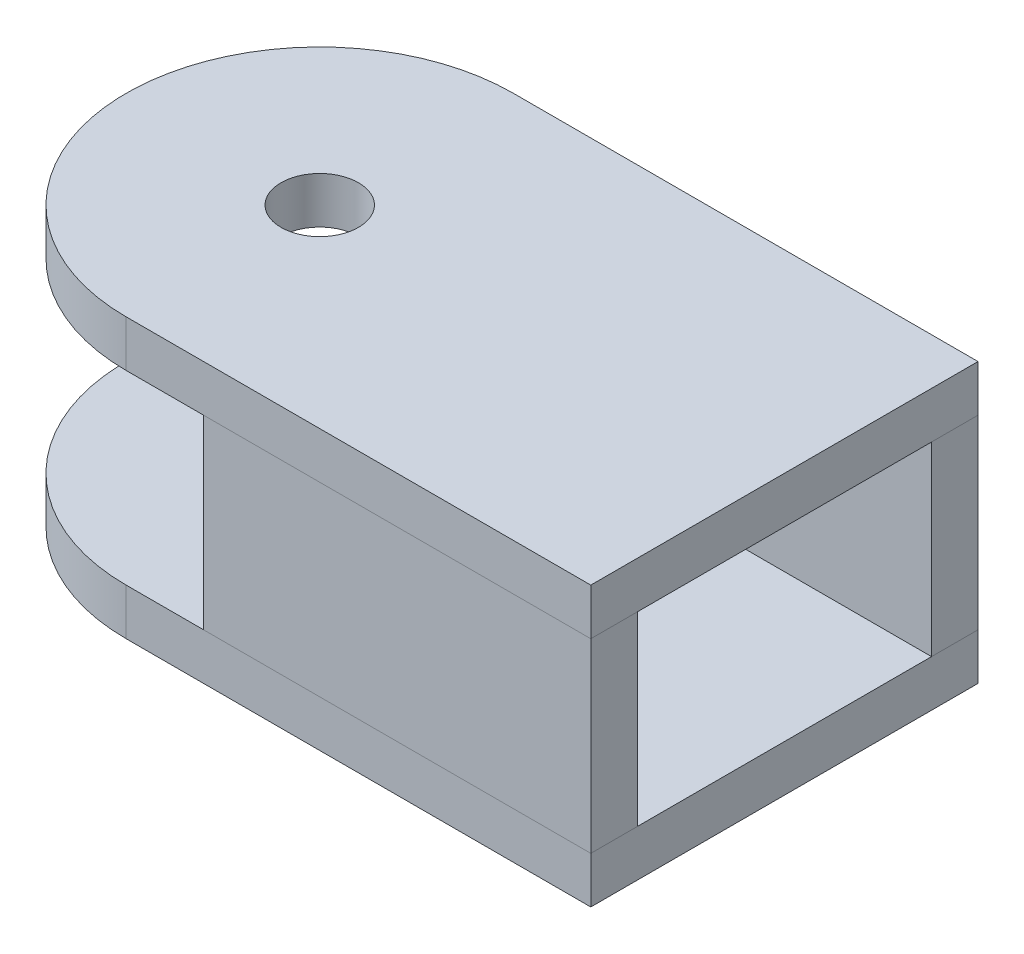
ISO-10303-21;
HEADER;
FILE_DESCRIPTION(('STEP AP214'),'2;1');
FILE_NAME('part.step','',(''),(''),'','','');
FILE_SCHEMA(('AUTOMOTIVE_DESIGN { 1 0 10303 214 1 1 1 1 }'));
ENDSEC;
DATA;
#1=APPLICATION_CONTEXT('core data for automotive mechanical design processes');
#2=APPLICATION_PROTOCOL_DEFINITION('international standard','automotive_design',2000,#1);
#3=PRODUCT_CONTEXT('',#1,'mechanical');
#4=PRODUCT('Part','Part','',(#3));
#5=PRODUCT_RELATED_PRODUCT_CATEGORY('part','',(#4));
#6=PRODUCT_DEFINITION_FORMATION('','',#4);
#7=PRODUCT_DEFINITION_CONTEXT('part definition',#1,'design');
#8=PRODUCT_DEFINITION('design','',#6,#7);
#9=PRODUCT_DEFINITION_SHAPE('','',#8);
#10=(LENGTH_UNIT() NAMED_UNIT(*) SI_UNIT(.MILLI.,.METRE.));
#11=(NAMED_UNIT(*) PLANE_ANGLE_UNIT() SI_UNIT($,.RADIAN.));
#12=(NAMED_UNIT(*) SI_UNIT($,.STERADIAN.) SOLID_ANGLE_UNIT());
#13=UNCERTAINTY_MEASURE_WITH_UNIT(LENGTH_MEASURE(1.E-05),#10,'distance_accuracy_value','');
#14=(GEOMETRIC_REPRESENTATION_CONTEXT(3) GLOBAL_UNCERTAINTY_ASSIGNED_CONTEXT((#13)) GLOBAL_UNIT_ASSIGNED_CONTEXT((#10,
#11,#12)) REPRESENTATION_CONTEXT('',''));
#15=CARTESIAN_POINT('',(0.,0.,0.));
#16=DIRECTION('',(0.,0.,1.));
#17=DIRECTION('',(1.,0.,0.));
#18=AXIS2_PLACEMENT_3D('',#15,#16,#17);
#19=CARTESIAN_POINT('',(-55.,12.,-25.));
#20=DIRECTION('',(0.,1.,0.));
#21=DIRECTION('',(-1.,0.,0.));
#22=AXIS2_PLACEMENT_3D('',#19,#20,#21);
#23=PLANE('',#22);
#24=DIRECTION('',(-1.,0.,0.));
#25=VECTOR('',#24,1.);
#26=CARTESIAN_POINT('',(30.,12.,19.));
#27=LINE('',#26,#25);
#28=CARTESIAN_POINT('',(30.,12.,19.));
#29=VERTEX_POINT('',#28);
#30=CARTESIAN_POINT('',(-20.,12.,19.));
#31=VERTEX_POINT('',#30);
#32=EDGE_CURVE('E93',#29,#31,#27,.T.);
#33=ORIENTED_EDGE('',*,*,#32,.T.);
#34=DIRECTION('',(0.,0.,1.));
#35=VECTOR('',#34,1.);
#36=CARTESIAN_POINT('',(-20.,12.,25.));
#37=LINE('',#36,#35);
#38=CARTESIAN_POINT('',(-20.,12.,25.));
#39=VERTEX_POINT('',#38);
#40=EDGE_CURVE('E48',#31,#39,#37,.T.);
#41=ORIENTED_EDGE('',*,*,#40,.T.);
#42=DIRECTION('',(-1.,0.,0.));
#43=VECTOR('',#42,1.);
#44=CARTESIAN_POINT('',(-55.,12.,25.));
#45=LINE('',#44,#43);
#46=CARTESIAN_POINT('',(30.,12.,25.));
#47=VERTEX_POINT('',#46);
#48=EDGE_CURVE('E104',#47,#39,#45,.T.);
#49=ORIENTED_EDGE('',*,*,#48,.F.);
#50=DIRECTION('',(0.,0.,1.));
#51=VECTOR('',#50,1.);
#52=CARTESIAN_POINT('',(30.,12.,-25.));
#53=LINE('',#52,#51);
#54=EDGE_CURVE('E95',#29,#47,#53,.T.);
#55=ORIENTED_EDGE('',*,*,#54,.F.);
#56=EDGE_LOOP('',(#33,#41,#49,#55));
#57=FACE_BOUND('',#56,.T.);
#58=ADVANCED_FACE('F44',(#57),#23,.T.);
#59=CARTESIAN_POINT('',(30.,18.002,19.));
#60=DIRECTION('',(0.,0.,1.));
#61=DIRECTION('',(1.,0.,0.));
#62=AXIS2_PLACEMENT_3D('',#59,#60,#61);
#63=PLANE('',#62);
#64=ORIENTED_EDGE('',*,*,#32,.F.);
#65=DIRECTION('',(0.,-1.,0.));
#66=VECTOR('',#65,1.);
#67=CARTESIAN_POINT('',(30.,18.002,19.));
#68=LINE('',#67,#66);
#69=CARTESIAN_POINT('',(30.,-12.,19.));
#70=VERTEX_POINT('',#69);
#71=EDGE_CURVE('E101',#29,#70,#68,.T.);
#72=ORIENTED_EDGE('',*,*,#71,.T.);
#73=DIRECTION('',(-1.,0.,0.));
#74=VECTOR('',#73,1.);
#75=CARTESIAN_POINT('',(30.,-12.,19.));
#76=LINE('',#75,#74);
#77=CARTESIAN_POINT('',(-20.,-12.,19.));
#78=VERTEX_POINT('',#77);
#79=EDGE_CURVE('E53',#70,#78,#76,.T.);
#80=ORIENTED_EDGE('',*,*,#79,.T.);
#81=DIRECTION('',(0.,-1.,0.));
#82=VECTOR('',#81,1.);
#83=CARTESIAN_POINT('',(-20.,18.002,19.));
#84=LINE('',#83,#82);
#85=EDGE_CURVE('E89',#31,#78,#84,.T.);
#86=ORIENTED_EDGE('',*,*,#85,.F.);
#87=EDGE_LOOP('',(#64,#72,#80,#86));
#88=FACE_BOUND('',#87,.T.);
#89=ADVANCED_FACE('F98',(#88),#63,.F.);
#90=CARTESIAN_POINT('',(0.,-12.,0.));
#91=DIRECTION('',(0.,1.,0.));
#92=DIRECTION('',(-1.,0.,0.));
#93=AXIS2_PLACEMENT_3D('',#90,#91,#92);
#94=PLANE('',#93);
#95=DIRECTION('',(0.,0.,-1.));
#96=VECTOR('',#95,1.);
#97=CARTESIAN_POINT('',(30.,-12.,25.));
#98=LINE('',#97,#96);
#99=CARTESIAN_POINT('',(30.,-12.,25.));
#100=VERTEX_POINT('',#99);
#101=EDGE_CURVE('E12',#100,#70,#98,.T.);
#102=ORIENTED_EDGE('',*,*,#101,.F.);
#103=DIRECTION('',(1.,0.,0.));
#104=VECTOR('',#103,1.);
#105=CARTESIAN_POINT('',(30.,-12.,25.));
#106=LINE('',#105,#104);
#107=CARTESIAN_POINT('',(-20.,-12.,25.));
#108=VERTEX_POINT('',#107);
#109=EDGE_CURVE('E108',#108,#100,#106,.T.);
#110=ORIENTED_EDGE('',*,*,#109,.F.);
#111=DIRECTION('',(0.,0.,1.));
#112=VECTOR('',#111,1.);
#113=CARTESIAN_POINT('',(-20.,-12.,25.));
#114=LINE('',#113,#112);
#115=EDGE_CURVE('E109',#78,#108,#114,.T.);
#116=ORIENTED_EDGE('',*,*,#115,.F.);
#117=ORIENTED_EDGE('',*,*,#79,.F.);
#118=EDGE_LOOP('',(#102,#110,#116,#117));
#119=FACE_BOUND('',#118,.T.);
#120=ADVANCED_FACE('F126',(#119),#94,.F.);
#121=CARTESIAN_POINT('',(-20.,18.002,25.));
#122=DIRECTION('',(1.,0.,0.));
#123=DIRECTION('',(0.,1.,0.));
#124=AXIS2_PLACEMENT_3D('',#121,#122,#123);
#125=PLANE('',#124);
#126=ORIENTED_EDGE('',*,*,#40,.F.);
#127=ORIENTED_EDGE('',*,*,#85,.T.);
#128=ORIENTED_EDGE('',*,*,#115,.T.);
#129=DIRECTION('',(0.,-1.,0.));
#130=VECTOR('',#129,1.);
#131=CARTESIAN_POINT('',(-20.,18.002,25.));
#132=LINE('',#131,#130);
#133=EDGE_CURVE('E67',#39,#108,#132,.T.);
#134=ORIENTED_EDGE('',*,*,#133,.F.);
#135=EDGE_LOOP('',(#126,#127,#128,#134));
#136=FACE_BOUND('',#135,.T.);
#137=ADVANCED_FACE('F87',(#136),#125,.F.);
#138=CARTESIAN_POINT('',(30.,18.002,25.));
#139=DIRECTION('',(-1.,0.,0.));
#140=DIRECTION('',(0.,0.,1.));
#141=AXIS2_PLACEMENT_3D('',#138,#139,#140);
#142=PLANE('',#141);
#143=ORIENTED_EDGE('',*,*,#71,.F.);
#144=ORIENTED_EDGE('',*,*,#54,.T.);
#145=DIRECTION('',(0.,-1.,0.));
#146=VECTOR('',#145,1.);
#147=CARTESIAN_POINT('',(30.,18.002,25.));
#148=LINE('',#147,#146);
#149=EDGE_CURVE('E60',#47,#100,#148,.T.);
#150=ORIENTED_EDGE('',*,*,#149,.T.);
#151=ORIENTED_EDGE('',*,*,#101,.T.);
#152=EDGE_LOOP('',(#143,#144,#150,#151));
#153=FACE_BOUND('',#152,.T.);
#154=ADVANCED_FACE('F117',(#153),#142,.F.);
#155=CARTESIAN_POINT('',(30.,18.002,25.));
#156=DIRECTION('',(0.,0.,-1.));
#157=DIRECTION('',(-1.,0.,0.));
#158=AXIS2_PLACEMENT_3D('',#155,#156,#157);
#159=PLANE('',#158);
#160=ORIENTED_EDGE('',*,*,#149,.F.);
#161=ORIENTED_EDGE('',*,*,#48,.T.);
#162=ORIENTED_EDGE('',*,*,#133,.T.);
#163=ORIENTED_EDGE('',*,*,#109,.T.);
#164=EDGE_LOOP('',(#160,#161,#162,#163));
#165=FACE_BOUND('',#164,.T.);
#166=ADVANCED_FACE('F46',(#165),#159,.F.);
#167=CLOSED_SHELL('',(#58,#89,#120,#137,#154,#166));
#168=MANIFOLD_SOLID_BREP('B2',#167);
#169=CARTESIAN_POINT('',(-55.,12.,-25.));
#170=DIRECTION('',(0.,1.,0.));
#171=DIRECTION('',(-1.,0.,0.));
#172=AXIS2_PLACEMENT_3D('',#169,#170,#171);
#173=PLANE('',#172);
#174=DIRECTION('',(0.,0.,1.));
#175=VECTOR('',#174,1.);
#176=CARTESIAN_POINT('',(-20.,12.,-25.));
#177=LINE('',#176,#175);
#178=CARTESIAN_POINT('',(-20.,12.,-25.));
#179=VERTEX_POINT('',#178);
#180=CARTESIAN_POINT('',(-20.,12.,-19.));
#181=VERTEX_POINT('',#180);
#182=EDGE_CURVE('E232',#179,#181,#177,.T.);
#183=ORIENTED_EDGE('',*,*,#182,.T.);
#184=DIRECTION('',(1.,0.,0.));
#185=VECTOR('',#184,1.);
#186=CARTESIAN_POINT('',(30.,12.,-19.));
#187=LINE('',#186,#185);
#188=CARTESIAN_POINT('',(30.,12.,-19.));
#189=VERTEX_POINT('',#188);
#190=EDGE_CURVE('E182',#181,#189,#187,.T.);
#191=ORIENTED_EDGE('',*,*,#190,.T.);
#192=DIRECTION('',(0.,0.,1.));
#193=VECTOR('',#192,1.);
#194=CARTESIAN_POINT('',(30.,12.,-25.));
#195=LINE('',#194,#193);
#196=CARTESIAN_POINT('',(30.,12.,-25.));
#197=VERTEX_POINT('',#196);
#198=EDGE_CURVE('E222',#197,#189,#195,.T.);
#199=ORIENTED_EDGE('',*,*,#198,.F.);
#200=DIRECTION('',(-1.,0.,0.));
#201=VECTOR('',#200,1.);
#202=CARTESIAN_POINT('',(30.,12.,-25.));
#203=LINE('',#202,#201);
#204=EDGE_CURVE('E229',#197,#179,#203,.T.);
#205=ORIENTED_EDGE('',*,*,#204,.T.);
#206=EDGE_LOOP('',(#183,#191,#199,#205));
#207=FACE_BOUND('',#206,.T.);
#208=ADVANCED_FACE('F178',(#207),#173,.T.);
#209=CARTESIAN_POINT('',(30.,18.002,-25.));
#210=DIRECTION('',(0.,0.,1.));
#211=DIRECTION('',(1.,0.,0.));
#212=AXIS2_PLACEMENT_3D('',#209,#210,#211);
#213=PLANE('',#212);
#214=ORIENTED_EDGE('',*,*,#204,.F.);
#215=DIRECTION('',(0.,-1.,0.));
#216=VECTOR('',#215,1.);
#217=CARTESIAN_POINT('',(30.,18.002,-25.));
#218=LINE('',#217,#216);
#219=CARTESIAN_POINT('',(30.,-12.,-25.));
#220=VERTEX_POINT('',#219);
#221=EDGE_CURVE('E195',#197,#220,#218,.T.);
#222=ORIENTED_EDGE('',*,*,#221,.T.);
#223=DIRECTION('',(-1.,0.,0.));
#224=VECTOR('',#223,1.);
#225=CARTESIAN_POINT('',(30.,-12.,-25.));
#226=LINE('',#225,#224);
#227=CARTESIAN_POINT('',(-20.,-12.,-25.));
#228=VERTEX_POINT('',#227);
#229=EDGE_CURVE('E237',#220,#228,#226,.T.);
#230=ORIENTED_EDGE('',*,*,#229,.T.);
#231=DIRECTION('',(0.,-1.,0.));
#232=VECTOR('',#231,1.);
#233=CARTESIAN_POINT('',(-20.,18.002,-25.));
#234=LINE('',#233,#232);
#235=EDGE_CURVE('E203',#179,#228,#234,.T.);
#236=ORIENTED_EDGE('',*,*,#235,.F.);
#237=EDGE_LOOP('',(#214,#222,#230,#236));
#238=FACE_BOUND('',#237,.T.);
#239=ADVANCED_FACE('F246',(#238),#213,.F.);
#240=CARTESIAN_POINT('',(30.,18.002,-25.));
#241=DIRECTION('',(-1.,0.,0.));
#242=DIRECTION('',(0.,-1.,0.));
#243=AXIS2_PLACEMENT_3D('',#240,#241,#242);
#244=PLANE('',#243);
#245=ORIENTED_EDGE('',*,*,#221,.F.);
#246=ORIENTED_EDGE('',*,*,#198,.T.);
#247=DIRECTION('',(0.,-1.,0.));
#248=VECTOR('',#247,1.);
#249=CARTESIAN_POINT('',(30.,18.002,-19.));
#250=LINE('',#249,#248);
#251=CARTESIAN_POINT('',(30.,-12.,-19.));
#252=VERTEX_POINT('',#251);
#253=EDGE_CURVE('E226',#189,#252,#250,.T.);
#254=ORIENTED_EDGE('',*,*,#253,.T.);
#255=DIRECTION('',(0.,0.,-1.));
#256=VECTOR('',#255,1.);
#257=CARTESIAN_POINT('',(30.,-12.,-25.));
#258=LINE('',#257,#256);
#259=EDGE_CURVE('E42',#252,#220,#258,.T.);
#260=ORIENTED_EDGE('',*,*,#259,.T.);
#261=EDGE_LOOP('',(#245,#246,#254,#260));
#262=FACE_BOUND('',#261,.T.);
#263=ADVANCED_FACE('F224',(#262),#244,.F.);
#264=CARTESIAN_POINT('',(0.,-12.,0.));
#265=DIRECTION('',(0.,-1.,0.));
#266=DIRECTION('',(1.,0.,0.));
#267=AXIS2_PLACEMENT_3D('',#264,#265,#266);
#268=PLANE('',#267);
#269=ORIENTED_EDGE('',*,*,#259,.F.);
#270=DIRECTION('',(1.,0.,0.));
#271=VECTOR('',#270,1.);
#272=CARTESIAN_POINT('',(30.,-12.,-19.));
#273=LINE('',#272,#271);
#274=CARTESIAN_POINT('',(-20.,-12.,-19.));
#275=VERTEX_POINT('',#274);
#276=EDGE_CURVE('E187',#275,#252,#273,.T.);
#277=ORIENTED_EDGE('',*,*,#276,.F.);
#278=DIRECTION('',(0.,0.,1.));
#279=VECTOR('',#278,1.);
#280=CARTESIAN_POINT('',(-20.,-12.,-25.));
#281=LINE('',#280,#279);
#282=EDGE_CURVE('E240',#228,#275,#281,.T.);
#283=ORIENTED_EDGE('',*,*,#282,.F.);
#284=ORIENTED_EDGE('',*,*,#229,.F.);
#285=EDGE_LOOP('',(#269,#277,#283,#284));
#286=FACE_BOUND('',#285,.T.);
#287=ADVANCED_FACE('F252',(#286),#268,.T.);
#288=CARTESIAN_POINT('',(-20.,18.002,-25.));
#289=DIRECTION('',(1.,0.,0.));
#290=DIRECTION('',(0.,0.,-1.));
#291=AXIS2_PLACEMENT_3D('',#288,#289,#290);
#292=PLANE('',#291);
#293=ORIENTED_EDGE('',*,*,#182,.F.);
#294=ORIENTED_EDGE('',*,*,#235,.T.);
#295=ORIENTED_EDGE('',*,*,#282,.T.);
#296=DIRECTION('',(0.,-1.,0.));
#297=VECTOR('',#296,1.);
#298=CARTESIAN_POINT('',(-20.,18.002,-19.));
#299=LINE('',#298,#297);
#300=EDGE_CURVE('E238',#181,#275,#299,.T.);
#301=ORIENTED_EDGE('',*,*,#300,.F.);
#302=EDGE_LOOP('',(#293,#294,#295,#301));
#303=FACE_BOUND('',#302,.T.);
#304=ADVANCED_FACE('F245',(#303),#292,.F.);
#305=CARTESIAN_POINT('',(30.,18.002,-19.));
#306=DIRECTION('',(0.,0.,-1.));
#307=DIRECTION('',(-1.,0.,0.));
#308=AXIS2_PLACEMENT_3D('',#305,#306,#307);
#309=PLANE('',#308);
#310=ORIENTED_EDGE('',*,*,#190,.F.);
#311=ORIENTED_EDGE('',*,*,#300,.T.);
#312=ORIENTED_EDGE('',*,*,#276,.T.);
#313=ORIENTED_EDGE('',*,*,#253,.F.);
#314=EDGE_LOOP('',(#310,#311,#312,#313));
#315=FACE_BOUND('',#314,.T.);
#316=ADVANCED_FACE('F180',(#315),#309,.F.);
#317=CLOSED_SHELL('',(#208,#239,#263,#287,#304,#316));
#318=MANIFOLD_SOLID_BREP('B6',#317);
#319=CARTESIAN_POINT('',(30.,18.,25.));
#320=DIRECTION('',(-1.,0.,0.));
#321=DIRECTION('',(0.,0.,1.));
#322=AXIS2_PLACEMENT_3D('',#319,#320,#321);
#323=PLANE('',#322);
#324=DIRECTION('',(0.,-1.,0.));
#325=VECTOR('',#324,1.);
#326=CARTESIAN_POINT('',(30.,18.,25.));
#327=LINE('',#326,#325);
#328=CARTESIAN_POINT('',(30.,18.,25.));
#329=VERTEX_POINT('',#328);
#330=CARTESIAN_POINT('',(30.,12.,25.));
#331=VERTEX_POINT('',#330);
#332=EDGE_CURVE('E314',#329,#331,#327,.T.);
#333=ORIENTED_EDGE('',*,*,#332,.T.);
#334=DIRECTION('',(0.,0.,1.));
#335=VECTOR('',#334,1.);
#336=CARTESIAN_POINT('',(30.,12.,-25.));
#337=LINE('',#336,#335);
#338=CARTESIAN_POINT('',(30.,12.,-25.));
#339=VERTEX_POINT('',#338);
#340=EDGE_CURVE('E320',#339,#331,#337,.T.);
#341=ORIENTED_EDGE('',*,*,#340,.F.);
#342=DIRECTION('',(0.,-1.,0.));
#343=VECTOR('',#342,1.);
#344=CARTESIAN_POINT('',(30.,18.,-25.));
#345=LINE('',#344,#343);
#346=CARTESIAN_POINT('',(30.,18.,-25.));
#347=VERTEX_POINT('',#346);
#348=EDGE_CURVE('E366',#347,#339,#345,.T.);
#349=ORIENTED_EDGE('',*,*,#348,.F.);
#350=DIRECTION('',(0.,0.,-1.));
#351=VECTOR('',#350,1.);
#352=CARTESIAN_POINT('',(30.,18.,25.));
#353=LINE('',#352,#351);
#354=EDGE_CURVE('E353',#329,#347,#353,.T.);
#355=ORIENTED_EDGE('',*,*,#354,.F.);
#356=EDGE_LOOP('',(#333,#341,#349,#355));
#357=FACE_BOUND('',#356,.T.);
#358=ADVANCED_FACE('F310',(#357),#323,.F.);
#359=CARTESIAN_POINT('',(-30.,18.,-25.));
#360=DIRECTION('',(0.,0.,1.));
#361=DIRECTION('',(1.,0.,0.));
#362=AXIS2_PLACEMENT_3D('',#359,#360,#361);
#363=PLANE('',#362);
#364=ORIENTED_EDGE('',*,*,#348,.T.);
#365=DIRECTION('',(-1.,0.,0.));
#366=VECTOR('',#365,1.);
#367=CARTESIAN_POINT('',(-55.,12.,-25.));
#368=LINE('',#367,#366);
#369=CARTESIAN_POINT('',(-30.,12.,-25.));
#370=VERTEX_POINT('',#369);
#371=EDGE_CURVE('E379',#339,#370,#368,.T.);
#372=ORIENTED_EDGE('',*,*,#371,.T.);
#373=DIRECTION('',(0.,-1.,0.));
#374=VECTOR('',#373,1.);
#375=CARTESIAN_POINT('',(-30.,18.,-25.));
#376=LINE('',#375,#374);
#377=CARTESIAN_POINT('',(-30.,18.,-25.));
#378=VERTEX_POINT('',#377);
#379=EDGE_CURVE('E378',#378,#370,#376,.T.);
#380=ORIENTED_EDGE('',*,*,#379,.F.);
#381=DIRECTION('',(-1.,0.,0.));
#382=VECTOR('',#381,1.);
#383=CARTESIAN_POINT('',(-30.,18.,-25.));
#384=LINE('',#383,#382);
#385=EDGE_CURVE('E368',#347,#378,#384,.T.);
#386=ORIENTED_EDGE('',*,*,#385,.F.);
#387=EDGE_LOOP('',(#364,#372,#380,#386));
#388=FACE_BOUND('',#387,.T.);
#389=ADVANCED_FACE('F404',(#388),#363,.F.);
#390=CARTESIAN_POINT('',(-30.,18.,0.));
#391=DIRECTION('',(0.,-1.,0.));
#392=DIRECTION('',(0.,0.,-1.));
#393=AXIS2_PLACEMENT_3D('',#390,#391,#392);
#394=CYLINDRICAL_SURFACE('',#393,25.);
#395=CARTESIAN_POINT('',(-30.,12.,0.));
#396=DIRECTION('',(0.,1.,0.));
#397=DIRECTION('',(-1.,0.,0.));
#398=AXIS2_PLACEMENT_3D('',#395,#396,#397);
#399=CIRCLE('',#398,25.);
#400=CARTESIAN_POINT('',(-30.,12.,25.));
#401=VERTEX_POINT('',#400);
#402=EDGE_CURVE('E328',#370,#401,#399,.T.);
#403=ORIENTED_EDGE('',*,*,#402,.T.);
#404=DIRECTION('',(0.,-1.,0.));
#405=VECTOR('',#404,1.);
#406=CARTESIAN_POINT('',(-30.,18.,25.));
#407=LINE('',#406,#405);
#408=CARTESIAN_POINT('',(-30.,18.,25.));
#409=VERTEX_POINT('',#408);
#410=EDGE_CURVE('E373',#409,#401,#407,.T.);
#411=ORIENTED_EDGE('',*,*,#410,.F.);
#412=CARTESIAN_POINT('',(-30.,18.,0.));
#413=DIRECTION('',(0.,1.,0.));
#414=DIRECTION('',(0.,0.,1.));
#415=AXIS2_PLACEMENT_3D('',#412,#413,#414);
#416=CIRCLE('',#415,25.);
#417=EDGE_CURVE('E356',#378,#409,#416,.T.);
#418=ORIENTED_EDGE('',*,*,#417,.F.);
#419=ORIENTED_EDGE('',*,*,#379,.T.);
#420=EDGE_LOOP('',(#403,#411,#418,#419));
#421=FACE_BOUND('',#420,.T.);
#422=ADVANCED_FACE('F384',(#421),#394,.T.);
#423=CARTESIAN_POINT('',(-30.,18.,25.));
#424=DIRECTION('',(0.,0.,-1.));
#425=DIRECTION('',(-1.,0.,0.));
#426=AXIS2_PLACEMENT_3D('',#423,#424,#425);
#427=PLANE('',#426);
#428=ORIENTED_EDGE('',*,*,#410,.T.);
#429=DIRECTION('',(-1.,0.,0.));
#430=VECTOR('',#429,1.);
#431=CARTESIAN_POINT('',(-55.,12.,25.));
#432=LINE('',#431,#430);
#433=EDGE_CURVE('E176',#331,#401,#432,.T.);
#434=ORIENTED_EDGE('',*,*,#433,.F.);
#435=ORIENTED_EDGE('',*,*,#332,.F.);
#436=DIRECTION('',(1.,0.,0.));
#437=VECTOR('',#436,1.);
#438=CARTESIAN_POINT('',(-30.,18.,25.));
#439=LINE('',#438,#437);
#440=EDGE_CURVE('E348',#409,#329,#439,.T.);
#441=ORIENTED_EDGE('',*,*,#440,.F.);
#442=EDGE_LOOP('',(#428,#434,#435,#441));
#443=FACE_BOUND('',#442,.T.);
#444=ADVANCED_FACE('F363',(#443),#427,.F.);
#445=CARTESIAN_POINT('',(-30.,18.,0.));
#446=DIRECTION('',(0.,-1.,0.));
#447=DIRECTION('',(0.,0.,-1.));
#448=AXIS2_PLACEMENT_3D('',#445,#446,#447);
#449=CYLINDRICAL_SURFACE('',#448,5.);
#450=CARTESIAN_POINT('',(-30.,12.,0.));
#451=DIRECTION('',(0.,1.,0.));
#452=DIRECTION('',(-1.,0.,0.));
#453=AXIS2_PLACEMENT_3D('',#450,#451,#452);
#454=CIRCLE('',#453,5.);
#455=CARTESIAN_POINT('',(-35.,12.,0.));
#456=VERTEX_POINT('',#455);
#457=EDGE_CURVE('E359',#456,#456,#454,.T.);
#458=ORIENTED_EDGE('',*,*,#457,.F.);
#459=EDGE_LOOP('',(#458));
#460=FACE_BOUND('',#459,.T.);
#461=CARTESIAN_POINT('',(-30.,18.,0.));
#462=DIRECTION('',(0.,1.,0.));
#463=DIRECTION('',(0.,0.,1.));
#464=AXIS2_PLACEMENT_3D('',#461,#462,#463);
#465=CIRCLE('',#464,5.);
#466=CARTESIAN_POINT('',(-30.,18.,5.));
#467=VERTEX_POINT('',#466);
#468=EDGE_CURVE('E369',#467,#467,#465,.T.);
#469=ORIENTED_EDGE('',*,*,#468,.T.);
#470=EDGE_LOOP('',(#469));
#471=FACE_BOUND('',#470,.T.);
#472=ADVANCED_FACE('F312',(#460,#471),#449,.F.);
#473=CARTESIAN_POINT('',(-30.,18.,0.));
#474=DIRECTION('',(0.,1.,0.));
#475=DIRECTION('',(0.,0.,1.));
#476=AXIS2_PLACEMENT_3D('',#473,#474,#475);
#477=PLANE('',#476);
#478=ORIENTED_EDGE('',*,*,#354,.T.);
#479=ORIENTED_EDGE('',*,*,#385,.T.);
#480=ORIENTED_EDGE('',*,*,#417,.T.);
#481=ORIENTED_EDGE('',*,*,#440,.T.);
#482=EDGE_LOOP('',(#478,#479,#480,#481));
#483=FACE_BOUND('',#482,.T.);
#484=ORIENTED_EDGE('',*,*,#468,.F.);
#485=EDGE_LOOP('',(#484));
#486=FACE_BOUND('',#485,.T.);
#487=ADVANCED_FACE('F350',(#483,#486),#477,.T.);
#488=CARTESIAN_POINT('',(-55.,12.,-25.));
#489=DIRECTION('',(0.,1.,0.));
#490=DIRECTION('',(-1.,0.,0.));
#491=AXIS2_PLACEMENT_3D('',#488,#489,#490);
#492=PLANE('',#491);
#493=ORIENTED_EDGE('',*,*,#457,.T.);
#494=EDGE_LOOP('',(#493));
#495=FACE_BOUND('',#494,.T.);
#496=ORIENTED_EDGE('',*,*,#402,.F.);
#497=ORIENTED_EDGE('',*,*,#371,.F.);
#498=ORIENTED_EDGE('',*,*,#340,.T.);
#499=ORIENTED_EDGE('',*,*,#433,.T.);
#500=EDGE_LOOP('',(#496,#497,#498,#499));
#501=FACE_BOUND('',#500,.T.);
#502=ADVANCED_FACE('F390',(#495,#501),#492,.F.);
#503=CLOSED_SHELL('',(#358,#389,#422,#444,#472,#487,#502));
#504=MANIFOLD_SOLID_BREP('B36',#503);
#505=CARTESIAN_POINT('',(-30.,18.,25.));
#506=DIRECTION('',(0.,0.,-1.));
#507=DIRECTION('',(-1.,0.,0.));
#508=AXIS2_PLACEMENT_3D('',#505,#506,#507);
#509=PLANE('',#508);
#510=DIRECTION('',(0.,-1.,0.));
#511=VECTOR('',#510,1.);
#512=CARTESIAN_POINT('',(30.,18.,25.));
#513=LINE('',#512,#511);
#514=CARTESIAN_POINT('',(30.,-12.,25.));
#515=VERTEX_POINT('',#514);
#516=CARTESIAN_POINT('',(30.,-18.,25.));
#517=VERTEX_POINT('',#516);
#518=EDGE_CURVE('E478',#515,#517,#513,.T.);
#519=ORIENTED_EDGE('',*,*,#518,.F.);
#520=DIRECTION('',(1.,0.,0.));
#521=VECTOR('',#520,1.);
#522=CARTESIAN_POINT('',(-55.,-12.,25.));
#523=LINE('',#522,#521);
#524=CARTESIAN_POINT('',(-30.,-12.,25.));
#525=VERTEX_POINT('',#524);
#526=EDGE_CURVE('E494',#525,#515,#523,.T.);
#527=ORIENTED_EDGE('',*,*,#526,.F.);
#528=DIRECTION('',(0.,-1.,0.));
#529=VECTOR('',#528,1.);
#530=CARTESIAN_POINT('',(-30.,18.,25.));
#531=LINE('',#530,#529);
#532=CARTESIAN_POINT('',(-30.,-18.,25.));
#533=VERTEX_POINT('',#532);
#534=EDGE_CURVE('E507',#525,#533,#531,.T.);
#535=ORIENTED_EDGE('',*,*,#534,.T.);
#536=DIRECTION('',(1.,0.,0.));
#537=VECTOR('',#536,1.);
#538=CARTESIAN_POINT('',(-30.,-18.,25.));
#539=LINE('',#538,#537);
#540=EDGE_CURVE('E505',#533,#517,#539,.T.);
#541=ORIENTED_EDGE('',*,*,#540,.T.);
#542=EDGE_LOOP('',(#519,#527,#535,#541));
#543=FACE_BOUND('',#542,.T.);
#544=ADVANCED_FACE('F454',(#543),#509,.F.);
#545=CARTESIAN_POINT('',(-30.,18.,0.));
#546=DIRECTION('',(0.,-1.,0.));
#547=DIRECTION('',(0.,0.,-1.));
#548=AXIS2_PLACEMENT_3D('',#545,#546,#547);
#549=CYLINDRICAL_SURFACE('',#548,25.);
#550=ORIENTED_EDGE('',*,*,#534,.F.);
#551=CARTESIAN_POINT('',(-30.,-12.,0.));
#552=DIRECTION('',(0.,-1.,0.));
#553=DIRECTION('',(1.,0.,0.));
#554=AXIS2_PLACEMENT_3D('',#551,#552,#553);
#555=CIRCLE('',#554,25.);
#556=CARTESIAN_POINT('',(-30.,-12.,-25.));
#557=VERTEX_POINT('',#556);
#558=EDGE_CURVE('E470',#525,#557,#555,.T.);
#559=ORIENTED_EDGE('',*,*,#558,.T.);
#560=DIRECTION('',(0.,-1.,0.));
#561=VECTOR('',#560,1.);
#562=CARTESIAN_POINT('',(-30.,18.,-25.));
#563=LINE('',#562,#561);
#564=CARTESIAN_POINT('',(-30.,-18.,-25.));
#565=VERTEX_POINT('',#564);
#566=EDGE_CURVE('E463',#557,#565,#563,.T.);
#567=ORIENTED_EDGE('',*,*,#566,.T.);
#568=CARTESIAN_POINT('',(-30.,-18.,0.));
#569=DIRECTION('',(0.,1.,0.));
#570=DIRECTION('',(0.,0.,1.));
#571=AXIS2_PLACEMENT_3D('',#568,#569,#570);
#572=CIRCLE('',#571,25.);
#573=EDGE_CURVE('E510',#565,#533,#572,.T.);
#574=ORIENTED_EDGE('',*,*,#573,.T.);
#575=EDGE_LOOP('',(#550,#559,#567,#574));
#576=FACE_BOUND('',#575,.T.);
#577=ADVANCED_FACE('F518',(#576),#549,.T.);
#578=CARTESIAN_POINT('',(-30.,18.,-25.));
#579=DIRECTION('',(0.,0.,1.));
#580=DIRECTION('',(1.,0.,0.));
#581=AXIS2_PLACEMENT_3D('',#578,#579,#580);
#582=PLANE('',#581);
#583=ORIENTED_EDGE('',*,*,#566,.F.);
#584=DIRECTION('',(1.,0.,0.));
#585=VECTOR('',#584,1.);
#586=CARTESIAN_POINT('',(-55.,-12.,-25.));
#587=LINE('',#586,#585);
#588=CARTESIAN_POINT('',(30.,-12.,-25.));
#589=VERTEX_POINT('',#588);
#590=EDGE_CURVE('E500',#557,#589,#587,.T.);
#591=ORIENTED_EDGE('',*,*,#590,.T.);
#592=DIRECTION('',(0.,-1.,0.));
#593=VECTOR('',#592,1.);
#594=CARTESIAN_POINT('',(30.,18.,-25.));
#595=LINE('',#594,#593);
#596=CARTESIAN_POINT('',(30.,-18.,-25.));
#597=VERTEX_POINT('',#596);
#598=EDGE_CURVE('E308',#589,#597,#595,.T.);
#599=ORIENTED_EDGE('',*,*,#598,.T.);
#600=DIRECTION('',(-1.,0.,0.));
#601=VECTOR('',#600,1.);
#602=CARTESIAN_POINT('',(-30.,-18.,-25.));
#603=LINE('',#602,#601);
#604=EDGE_CURVE('E522',#597,#565,#603,.T.);
#605=ORIENTED_EDGE('',*,*,#604,.T.);
#606=EDGE_LOOP('',(#583,#591,#599,#605));
#607=FACE_BOUND('',#606,.T.);
#608=ADVANCED_FACE('F523',(#607),#582,.F.);
#609=CARTESIAN_POINT('',(30.,18.,25.));
#610=DIRECTION('',(-1.,0.,0.));
#611=DIRECTION('',(0.,0.,1.));
#612=AXIS2_PLACEMENT_3D('',#609,#610,#611);
#613=PLANE('',#612);
#614=ORIENTED_EDGE('',*,*,#598,.F.);
#615=DIRECTION('',(0.,0.,1.));
#616=VECTOR('',#615,1.);
#617=CARTESIAN_POINT('',(30.,-12.,-25.));
#618=LINE('',#617,#616);
#619=EDGE_CURVE('E496',#589,#515,#618,.T.);
#620=ORIENTED_EDGE('',*,*,#619,.T.);
#621=ORIENTED_EDGE('',*,*,#518,.T.);
#622=DIRECTION('',(0.,0.,-1.));
#623=VECTOR('',#622,1.);
#624=CARTESIAN_POINT('',(30.,-18.,25.));
#625=LINE('',#624,#623);
#626=EDGE_CURVE('E525',#517,#597,#625,.T.);
#627=ORIENTED_EDGE('',*,*,#626,.T.);
#628=EDGE_LOOP('',(#614,#620,#621,#627));
#629=FACE_BOUND('',#628,.T.);
#630=ADVANCED_FACE('F456',(#629),#613,.F.);
#631=CARTESIAN_POINT('',(-30.,-18.,0.));
#632=DIRECTION('',(0.,1.,0.));
#633=DIRECTION('',(0.,0.,1.));
#634=AXIS2_PLACEMENT_3D('',#631,#632,#633);
#635=PLANE('',#634);
#636=ORIENTED_EDGE('',*,*,#626,.F.);
#637=ORIENTED_EDGE('',*,*,#540,.F.);
#638=ORIENTED_EDGE('',*,*,#573,.F.);
#639=ORIENTED_EDGE('',*,*,#604,.F.);
#640=EDGE_LOOP('',(#636,#637,#638,#639));
#641=FACE_BOUND('',#640,.T.);
#642=CARTESIAN_POINT('',(-30.,-18.,0.));
#643=DIRECTION('',(0.,1.,0.));
#644=DIRECTION('',(0.,0.,1.));
#645=AXIS2_PLACEMENT_3D('',#642,#643,#644);
#646=CIRCLE('',#645,5.);
#647=CARTESIAN_POINT('',(-30.,-18.,5.));
#648=VERTEX_POINT('',#647);
#649=EDGE_CURVE('E531',#648,#648,#646,.T.);
#650=ORIENTED_EDGE('',*,*,#649,.T.);
#651=EDGE_LOOP('',(#650));
#652=FACE_BOUND('',#651,.T.);
#653=ADVANCED_FACE('F527',(#641,#652),#635,.F.);
#654=CARTESIAN_POINT('',(-30.,18.,0.));
#655=DIRECTION('',(0.,-1.,0.));
#656=DIRECTION('',(0.,0.,-1.));
#657=AXIS2_PLACEMENT_3D('',#654,#655,#656);
#658=CYLINDRICAL_SURFACE('',#657,5.);
#659=CARTESIAN_POINT('',(-30.,-12.,0.));
#660=DIRECTION('',(0.,-1.,0.));
#661=DIRECTION('',(1.,0.,0.));
#662=AXIS2_PLACEMENT_3D('',#659,#660,#661);
#663=CIRCLE('',#662,5.);
#664=CARTESIAN_POINT('',(-25.,-12.,0.));
#665=VERTEX_POINT('',#664);
#666=EDGE_CURVE('E458',#665,#665,#663,.T.);
#667=ORIENTED_EDGE('',*,*,#666,.F.);
#668=EDGE_LOOP('',(#667));
#669=FACE_BOUND('',#668,.T.);
#670=ORIENTED_EDGE('',*,*,#649,.F.);
#671=EDGE_LOOP('',(#670));
#672=FACE_BOUND('',#671,.T.);
#673=ADVANCED_FACE('F539',(#669,#672),#658,.F.);
#674=CARTESIAN_POINT('',(-55.,-12.,-25.));
#675=DIRECTION('',(0.,-1.,0.));
#676=DIRECTION('',(1.,0.,0.));
#677=AXIS2_PLACEMENT_3D('',#674,#675,#676);
#678=PLANE('',#677);
#679=ORIENTED_EDGE('',*,*,#666,.T.);
#680=EDGE_LOOP('',(#679));
#681=FACE_BOUND('',#680,.T.);
#682=ORIENTED_EDGE('',*,*,#526,.T.);
#683=ORIENTED_EDGE('',*,*,#619,.F.);
#684=ORIENTED_EDGE('',*,*,#590,.F.);
#685=ORIENTED_EDGE('',*,*,#558,.F.);
#686=EDGE_LOOP('',(#682,#683,#684,#685));
#687=FACE_BOUND('',#686,.T.);
#688=ADVANCED_FACE('F495',(#681,#687),#678,.F.);
#689=CLOSED_SHELL('',(#544,#577,#608,#630,#653,#673,#688));
#690=MANIFOLD_SOLID_BREP('B170',#689);
#691=ADVANCED_BREP_SHAPE_REPRESENTATION('',(#18,#168,#318,#504,#690),#14);
#692=SHAPE_DEFINITION_REPRESENTATION(#9,#691);
ENDSEC;
END-ISO-10303-21;
